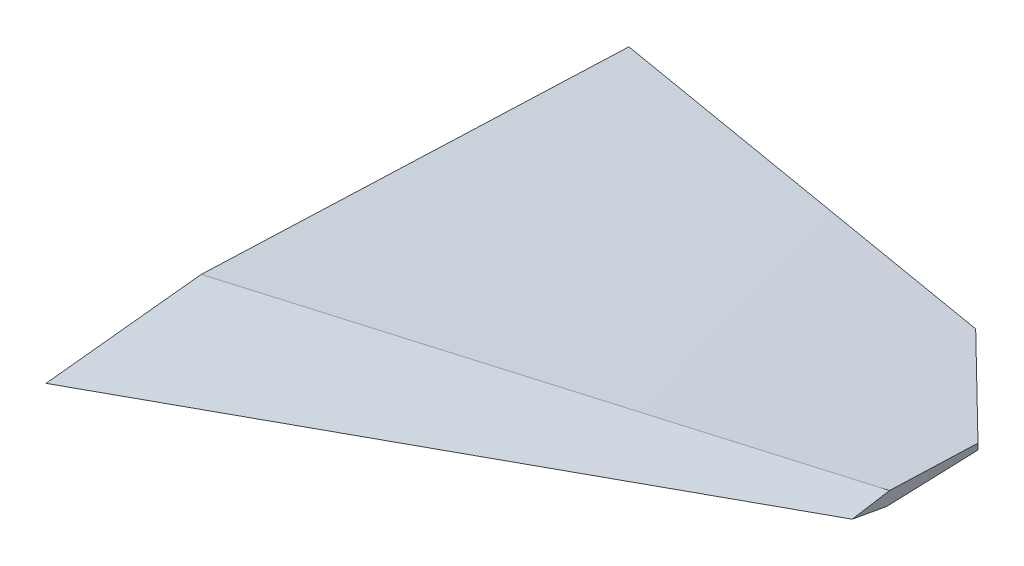
ISO-10303-21;
HEADER;
FILE_DESCRIPTION(('STEP AP214'),'2;1');
FILE_NAME('part.step','',(''),(''),'','','');
FILE_SCHEMA(('AUTOMOTIVE_DESIGN { 1 0 10303 214 1 1 1 1 }'));
ENDSEC;
DATA;
#1=APPLICATION_CONTEXT('core data for automotive mechanical design processes');
#2=APPLICATION_PROTOCOL_DEFINITION('international standard','automotive_design',2000,#1);
#3=PRODUCT_CONTEXT('',#1,'mechanical');
#4=PRODUCT('Part','Part','',(#3));
#5=PRODUCT_RELATED_PRODUCT_CATEGORY('part','',(#4));
#6=PRODUCT_DEFINITION_FORMATION('','',#4);
#7=PRODUCT_DEFINITION_CONTEXT('part definition',#1,'design');
#8=PRODUCT_DEFINITION('design','',#6,#7);
#9=PRODUCT_DEFINITION_SHAPE('','',#8);
#10=(LENGTH_UNIT() NAMED_UNIT(*) SI_UNIT(.MILLI.,.METRE.));
#11=(NAMED_UNIT(*) PLANE_ANGLE_UNIT() SI_UNIT($,.RADIAN.));
#12=(NAMED_UNIT(*) SI_UNIT($,.STERADIAN.) SOLID_ANGLE_UNIT());
#13=UNCERTAINTY_MEASURE_WITH_UNIT(LENGTH_MEASURE(1.E-05),#10,'distance_accuracy_value','');
#14=(GEOMETRIC_REPRESENTATION_CONTEXT(3) GLOBAL_UNCERTAINTY_ASSIGNED_CONTEXT((#13)) GLOBAL_UNIT_ASSIGNED_CONTEXT((#10,
#11,#12)) REPRESENTATION_CONTEXT('',''));
#15=CARTESIAN_POINT('',(0.,0.,0.));
#16=DIRECTION('',(0.,0.,1.));
#17=DIRECTION('',(1.,0.,0.));
#18=AXIS2_PLACEMENT_3D('',#15,#16,#17);
#19=CARTESIAN_POINT('',(2264.,0.,-7652.5));
#20=DIRECTION('',(-0.697531016860244,0.,0.716554590047342));
#21=DIRECTION('',(0.716554590047342,0.,0.697531016860244));
#22=AXIS2_PLACEMENT_3D('',#19,#20,#21);
#23=PLANE('',#22);
#24=DIRECTION('',(-0.181855240179557,-0.967259031099984,-0.177027224953551));
#25=VECTOR('',#24,1.);
#26=CARTESIAN_POINT('',(2777.18459449673,786.986197849038,-7152.93977526867));
#27=LINE('',#26,#25);
#28=CARTESIAN_POINT('',(2917.91105544952,1535.48780900373,-7015.94941504916));
#29=VERTEX_POINT('',#28);
#30=CARTESIAN_POINT('',(2912.13388329117,1504.75995129195,-7021.57321095549));
#31=VERTEX_POINT('',#30);
#32=EDGE_CURVE('E207',#29,#31,#27,.T.);
#33=ORIENTED_EDGE('',*,*,#32,.T.);
#34=CARTESIAN_POINT('',(2912.13388329117,1504.75995129195,-7021.5732109555));
#35=CARTESIAN_POINT('',(2902.12505219001,1507.11050301799,-7031.31632087699));
#36=CARTESIAN_POINT('',(2892.11583480539,1509.45785003662,-7041.05980682661));
#37=CARTESIAN_POINT('',(2872.09668602345,1514.14655406342,-7060.54747378248));
#38=CARTESIAN_POINT('',(2862.08675462657,1516.48791107528,-7070.29165478829));
#39=CARTESIAN_POINT('',(2842.0662283264,1521.16505638709,-7089.78066269111));
#40=CARTESIAN_POINT('',(2832.0556334234,1523.50084468943,-7099.52548958784));
#41=CARTESIAN_POINT('',(2812.03382465856,1528.16722504834,-7119.0157459076));
#42=CARTESIAN_POINT('',(2802.0226107969,1530.49781710633,-7128.76117533046));
#43=CARTESIAN_POINT('',(2781.99960507437,1535.15414719082,-7148.25259683026));
#44=CARTESIAN_POINT('',(2771.98781321359,1537.47988521806,-7157.99858890712));
#45=CARTESIAN_POINT('',(2751.96368880111,1542.12681900675,-7177.49109939715));
#46=CARTESIAN_POINT('',(2741.95135624944,1544.44801476844,-7187.23761781028));
#47=CARTESIAN_POINT('',(2721.92618674402,1549.08614906913,-7206.73114564742));
#48=CARTESIAN_POINT('',(2711.91334979036,1551.40308760891,-7216.47815507133));
#49=CARTESIAN_POINT('',(2691.8872002493,1556.03296983426,-7235.97263692547));
#50=CARTESIAN_POINT('',(2681.87388766183,1558.34591351929,-7245.72010935575));
#51=CARTESIAN_POINT('',(2661.84681532834,1562.96804671853,-7265.21548950339));
#52=CARTESIAN_POINT('',(2651.83305558223,1565.2772362319,-7274.96339722084));
#53=CARTESIAN_POINT('',(2631.80511511008,1569.89208237054,-7294.45962245921));
#54=CARTESIAN_POINT('',(2621.79093438393,1572.19773899477,-7304.20793998025));
#55=CARTESIAN_POINT('',(2601.76217621634,1576.80572440556,-7323.70496120533));
#56=CARTESIAN_POINT('',(2591.74759877477,1579.10805319095,-7333.45366490952));
#57=CARTESIAN_POINT('',(2571.71806912773,1583.70956861293,-7352.9514371323));
#58=CARTESIAN_POINT('',(2561.70311692212,1586.00875524826,-7362.70050565103));
#59=CARTESIAN_POINT('',(2551.68799055691,1588.30646313811,-7372.44974370566));
#60=B_SPLINE_CURVE_WITH_KNOTS('',3,(#34,#35,#36,#37,#38,#39,#40,#41,#42,#43,#44,#45,#46,#47,#48,
#49,#50,#51,#52,#53,#54,#55,#56,#57,#58,#59),.UNSPECIFIED.,.F.,.F.,(4,2,2,2,2,2,2,2,2,2,2,2,4),
(0.,42.4931735957222,84.9863210033463,127.4794502047,169.972567701935,212.465678779138,
254.958787715266,297.451888973896,339.944996179659,382.438112883539,424.931242053921,
467.424386167427,509.917547284836),.UNSPECIFIED.);
#61=CARTESIAN_POINT('',(2551.68799055691,1588.30646313811,-7372.44974370566));
#62=VERTEX_POINT('',#61);
#63=EDGE_CURVE('E12',#31,#62,#60,.T.);
#64=ORIENTED_EDGE('',*,*,#63,.T.);
#65=CARTESIAN_POINT('',(2551.68799055691,1588.30646313811,-7372.44974370566));
#66=CARTESIAN_POINT('',(2561.85908933415,1586.81545891525,-7362.5486740995));
#67=CARTESIAN_POINT('',(2572.03030381676,1585.32599148495,-7352.64749185979));
#68=CARTESIAN_POINT('',(2592.37297369507,1582.35032101549,-7332.8448928632));
#69=CARTESIAN_POINT('',(2602.54442909067,1580.86411797496,-7322.94347610643));
#70=CARTESIAN_POINT('',(2622.88759502421,1577.89516639539,-7303.14039422422));
#71=CARTESIAN_POINT('',(2633.05930556207,1576.41241785509,-7293.23872909888));
#72=CARTESIAN_POINT('',(2653.40299741478,1573.45058449897,-7273.43513525995));
#73=CARTESIAN_POINT('',(2663.57497872956,1571.97149968204,-7263.53320654645));
#74=CARTESIAN_POINT('',(2683.91922896556,1569.01721889018,-7243.72906914857));
#75=CARTESIAN_POINT('',(2694.09149788671,1567.54202291435,-7233.82686046426));
#76=CARTESIAN_POINT('',(2714.43634157628,1564.59576382112,-7214.02214536823));
#77=CARTESIAN_POINT('',(2724.60891634464,1563.12470070312,-7204.11963895654));
#78=CARTESIAN_POINT('',(2744.95439375768,1560.18697149333,-7184.31430696155));
#79=CARTESIAN_POINT('',(2755.1272964024,1558.72030540233,-7174.41148137819));
#80=CARTESIAN_POINT('',(2775.47344849196,1555.79165792881,-7154.60549261845));
#81=CARTESIAN_POINT('',(2785.64669793681,1554.32967654654,-7144.70232944205));
#82=CARTESIAN_POINT('',(2805.99356655332,1551.41071086214,-7124.89564317818));
#83=CARTESIAN_POINT('',(2816.16718572505,1549.9537265608,-7114.99212009066));
#84=CARTESIAN_POINT('',(2836.51481882396,1547.04509614959,-7095.18468964039));
#85=CARTESIAN_POINT('',(2846.68883275126,1545.59345004123,-7085.28078227754));
#86=CARTESIAN_POINT('',(2867.03728250197,1542.69586548015,-7065.47255685649));
#87=CARTESIAN_POINT('',(2877.21171832558,1541.24992702993,-7055.56823879811));
#88=CARTESIAN_POINT('',(2897.56104221048,1538.36417238011,-7035.75916244998));
#89=CARTESIAN_POINT('',(2907.73593027205,1536.92435618436,-7025.85440415995));
#90=CARTESIAN_POINT('',(2917.91105544952,1535.48780900373,-7015.94941504914));
#91=B_SPLINE_CURVE_WITH_KNOTS('',3,(#65,#66,#67,#68,#69,#70,#71,#72,#73,#74,#75,#76,#77,#78,#79,
#80,#81,#82,#83,#84,#85,#86,#87,#88,#89,#90),.UNSPECIFIED.,.F.,.F.,(4,2,2,2,2,2,2,2,2,2,2,2,4),
(0.,42.8176331472219,85.6352485668465,128.452848431335,171.270435344161,214.088012415988,
256.905583355069,299.723162072028,342.54074306137,385.358330773943,428.175930671245,
470.993549428293,513.81119517947),.UNSPECIFIED.);
#92=EDGE_CURVE('E57',#62,#29,#91,.T.);
#93=ORIENTED_EDGE('',*,*,#92,.T.);
#94=EDGE_LOOP('',(#33,#64,#93));
#95=FACE_BOUND('',#94,.T.);
#96=ADVANCED_FACE('F47',(#95),#23,.F.);
#97=CARTESIAN_POINT('',(2539.45761462919,-477.445709562425,7.03929742032787E-13));
#98=DIRECTION('',(0.982781120457582,-0.184773562156871,0.));
#99=DIRECTION('',(0.184773562156871,0.982781120457582,0.));
#100=AXIS2_PLACEMENT_3D('',#97,#98,#99);
#101=PLANE('',#100);
#102=ORIENTED_EDGE('',*,*,#32,.F.);
#103=DIRECTION('',(0.00827464295975354,0.044011506756951,0.998996755528701));
#104=VECTOR('',#103,1.);
#105=CARTESIAN_POINT('',(2921.00431932246,1551.94038641487,-6642.5));
#106=LINE('',#105,#104);
#107=CARTESIAN_POINT('',(2921.00431932246,1551.94038641487,-6642.5));
#108=VERTEX_POINT('',#107);
#109=EDGE_CURVE('E195',#29,#108,#106,.T.);
#110=ORIENTED_EDGE('',*,*,#109,.T.);
#111=DIRECTION('',(-0.0391264202249026,-0.208107191631007,0.977323140026798));
#112=VECTOR('',#111,1.);
#113=CARTESIAN_POINT('',(2914.99917855236,1520.,-6492.5));
#114=LINE('',#113,#112);
#115=CARTESIAN_POINT('',(2914.99917855236,1520.,-6492.5));
#116=VERTEX_POINT('',#115);
#117=EDGE_CURVE('E257',#108,#116,#114,.T.);
#118=ORIENTED_EDGE('',*,*,#117,.T.);
#119=DIRECTION('',(-0.0391264202249025,-0.208107191631009,-0.977323140026797));
#120=VECTOR('',#119,1.);
#121=CARTESIAN_POINT('',(2914.99917855236,1520.,-6492.5));
#122=LINE('',#121,#120);
#123=CARTESIAN_POINT('',(2908.99403778226,1488.05961358513,-6642.5));
#124=VERTEX_POINT('',#123);
#125=EDGE_CURVE('E104',#116,#124,#122,.T.);
#126=ORIENTED_EDGE('',*,*,#125,.T.);
#127=DIRECTION('',(0.00827464295975354,0.044011506756951,-0.998996755528701));
#128=VECTOR('',#127,1.);
#129=CARTESIAN_POINT('',(2908.99403778226,1488.05961358513,-6642.5));
#130=LINE('',#129,#128);
#131=EDGE_CURVE('E51',#124,#31,#130,.T.);
#132=ORIENTED_EDGE('',*,*,#131,.T.);
#133=EDGE_LOOP('',(#102,#110,#118,#126,#132));
#134=FACE_BOUND('',#133,.T.);
#135=ADVANCED_FACE('F149',(#134),#101,.T.);
#136=CARTESIAN_POINT('',(1079.99917855236,0.,0.));
#137=DIRECTION('',(1.,0.,0.));
#138=DIRECTION('',(0.,0.,-1.));
#139=AXIS2_PLACEMENT_3D('',#136,#137,#138);
#140=PLANE('',#139);
#141=DIRECTION('',(0.,-0.107073199719951,-0.994251140256692));
#142=VECTOR('',#141,1.);
#143=CARTESIAN_POINT('',(1079.99917855236,1865.,-4952.5));
#144=LINE('',#143,#142);
#145=CARTESIAN_POINT('',(1079.99917855236,1865.,-4952.5));
#146=VERTEX_POINT('',#145);
#147=CARTESIAN_POINT('',(1079.99917855236,1795.,-5602.5));
#148=VERTEX_POINT('',#147);
#149=EDGE_CURVE('E100',#146,#148,#144,.T.);
#150=ORIENTED_EDGE('',*,*,#149,.F.);
#151=DIRECTION('',(0.,-0.107073199719951,0.994251140256692));
#152=VECTOR('',#151,1.);
#153=CARTESIAN_POINT('',(1079.99917855236,1865.,-4952.5));
#154=LINE('',#153,#152);
#155=CARTESIAN_POINT('',(1079.99917855236,1935.,-5602.5));
#156=VERTEX_POINT('',#155);
#157=EDGE_CURVE('E112',#156,#146,#154,.T.);
#158=ORIENTED_EDGE('',*,*,#157,.F.);
#159=DIRECTION('',(0.,0.0390762771746633,0.999236230609243));
#160=VECTOR('',#159,1.);
#161=CARTESIAN_POINT('',(1079.99917855236,1935.,-5602.5));
#162=LINE('',#161,#160);
#163=CARTESIAN_POINT('',(1079.99917855236,1865.,-7392.5));
#164=VERTEX_POINT('',#163);
#165=EDGE_CURVE('E121',#164,#156,#162,.T.);
#166=ORIENTED_EDGE('',*,*,#165,.F.);
#167=DIRECTION('',(0.,0.0390762771746631,-0.999236230609243));
#168=VECTOR('',#167,1.);
#169=CARTESIAN_POINT('',(1079.99917855236,1795.,-5602.5));
#170=LINE('',#169,#168);
#171=EDGE_CURVE('E127',#148,#164,#170,.T.);
#172=ORIENTED_EDGE('',*,*,#171,.F.);
#173=EDGE_LOOP('',(#150,#158,#166,#172));
#174=FACE_BOUND('',#173,.T.);
#175=ADVANCED_FACE('F125',(#174),#140,.F.);
#176=CARTESIAN_POINT('',(1079.99917855236,1865.,-7392.5));
#177=CARTESIAN_POINT('',(2914.99917855236,1520.,-7367.5));
#178=CARTESIAN_POINT('',(1079.99917855236,1876.66666666667,-7094.16666666667));
#179=CARTESIAN_POINT('',(2916.00003534738,1525.32339773581,-7246.66666666669));
#180=CARTESIAN_POINT('',(1079.99917855236,1888.33333333333,-6795.83333333334));
#181=CARTESIAN_POINT('',(2917.00089214239,1530.64679547162,-7125.83333333337));
#182=CARTESIAN_POINT('',(1079.99917855236,1911.66666666667,-6199.16666666667));
#183=CARTESIAN_POINT('',(2919.00260573242,1541.29359094325,-6884.16666666671));
#184=CARTESIAN_POINT('',(1079.99917855236,1923.33333333333,-5900.83333333334));
#185=CARTESIAN_POINT('',(2920.00346252744,1546.61698867906,-6763.33333333336));
#186=CARTESIAN_POINT('',(1079.99917855236,1935.,-5602.5));
#187=CARTESIAN_POINT('',(2921.00431932246,1551.94038641487,-6642.5));
#188=B_SPLINE_SURFACE_WITH_KNOTS('',3,1,((#176,#177),(#178,#179),(#180,#181),(#182,#183),(#184,
#185),(#186,#187)),.UNSPECIFIED.,.F.,.F.,.F.,(4,2,4),(2,2),(0.,0.5,1.),(0.,1.),.UNSPECIFIED.);
#189=DIRECTION('',(-0.982693037901236,0.184757001676254,-0.0133881885272636));
#190=VECTOR('',#189,1.);
#191=CARTESIAN_POINT('',(1997.49917855236,1692.5,-7380.));
#192=LINE('',#191,#190);
#193=EDGE_CURVE('E120',#62,#164,#192,.T.);
#194=DIRECTION('',(0.856732455634059,-0.178261101032962,-0.483975701168718));
#195=VECTOR('',#194,1.);
#196=CARTESIAN_POINT('',(2000.50174893741,1743.47019320744,-6122.5));
#197=LINE('',#196,#195);
#198=EDGE_CURVE('E109',#156,#108,#197,.T.);
#199=ORIENTED_EDGE('',*,*,#92,.F.);
#200=ORIENTED_EDGE('',*,*,#193,.T.);
#201=ORIENTED_EDGE('',*,*,#165,.T.);
#202=ORIENTED_EDGE('',*,*,#198,.T.);
#203=ORIENTED_EDGE('',*,*,#109,.F.);
#204=EDGE_LOOP('',(#199,#200,#201,#202,#203));
#205=FACE_BOUND('',#204,.T.);
#206=ADVANCED_FACE('F148',(#205),#188,.T.);
#207=CARTESIAN_POINT('',(1079.99917855236,1935.,-5602.5));
#208=CARTESIAN_POINT('',(2921.00431932246,1551.94038641487,-6642.5));
#209=CARTESIAN_POINT('',(1079.99917855236,1923.33333333333,-5494.16666666666));
#210=CARTESIAN_POINT('',(2920.00346252744,1546.61698867906,-6617.49999999999));
#211=CARTESIAN_POINT('',(1079.99917855236,1911.66666666667,-5385.83333333333));
#212=CARTESIAN_POINT('',(2919.00260573242,1541.29359094325,-6592.49999999999));
#213=CARTESIAN_POINT('',(1079.99917855236,1888.33333333333,-5169.16666666666));
#214=CARTESIAN_POINT('',(2917.00089214239,1530.64679547162,-6542.49999999999));
#215=CARTESIAN_POINT('',(1079.99917855236,1876.66666666667,-5060.83333333333));
#216=CARTESIAN_POINT('',(2916.00003534738,1525.32339773581,-6517.49999999999));
#217=CARTESIAN_POINT('',(1079.99917855236,1865.,-4952.5));
#218=CARTESIAN_POINT('',(2914.99917855236,1520.,-6492.5));
#219=B_SPLINE_SURFACE_WITH_KNOTS('',3,1,((#207,#208),(#209,#210),(#211,#212),(#213,#214),(#215,
#216),(#217,#218)),.UNSPECIFIED.,.F.,.F.,.F.,(4,2,4),(2,2),(0.,0.5,1.),(0.,1.),.UNSPECIFIED.);
#220=DIRECTION('',(0.758170609986903,-0.142544338117429,-0.636284871596639));
#221=VECTOR('',#220,1.);
#222=CARTESIAN_POINT('',(1997.49917855236,1692.5,-5722.5));
#223=LINE('',#222,#221);
#224=EDGE_CURVE('E95',#146,#116,#223,.T.);
#225=ORIENTED_EDGE('',*,*,#157,.T.);
#226=ORIENTED_EDGE('',*,*,#224,.T.);
#227=ORIENTED_EDGE('',*,*,#117,.F.);
#228=ORIENTED_EDGE('',*,*,#198,.F.);
#229=EDGE_LOOP('',(#225,#226,#227,#228));
#230=FACE_BOUND('',#229,.T.);
#231=ADVANCED_FACE('F114',(#230),#219,.T.);
#232=CARTESIAN_POINT('',(1079.99917855236,1795.,-5602.5));
#233=CARTESIAN_POINT('',(2908.99403778226,1488.05961358513,-6642.5));
#234=CARTESIAN_POINT('',(1079.99917855236,1806.66666666667,-5900.83333333333));
#235=CARTESIAN_POINT('',(2909.99489457728,1493.38301132094,-6763.33333333332));
#236=CARTESIAN_POINT('',(1079.99917855236,1818.33333333333,-6199.16666666666));
#237=CARTESIAN_POINT('',(2910.99575137229,1498.70640905675,-6884.16666666665));
#238=CARTESIAN_POINT('',(1079.99917855236,1841.66666666667,-6795.83333333332));
#239=CARTESIAN_POINT('',(2912.99746496233,1509.35320452838,-7125.83333333332));
#240=CARTESIAN_POINT('',(1079.99917855236,1853.33333333333,-7094.16666666666));
#241=CARTESIAN_POINT('',(2913.99832175734,1514.67660226419,-7246.66666666666));
#242=CARTESIAN_POINT('',(1079.99917855236,1865.,-7392.5));
#243=CARTESIAN_POINT('',(2914.99917855236,1520.,-7367.5));
#244=B_SPLINE_SURFACE_WITH_KNOTS('',3,1,((#232,#233),(#234,#235),(#236,#237),(#238,#239),(#240,
#241),(#242,#243)),.UNSPECIFIED.,.F.,.F.,.F.,(4,2,4),(2,2),(0.,0.5,1.),(0.,1.),.UNSPECIFIED.);
#245=DIRECTION('',(0.860188376249254,-0.144356093328056,-0.489118876843588));
#246=VECTOR('',#245,1.);
#247=CARTESIAN_POINT('',(1994.49660816731,1641.52980679256,-6122.5));
#248=LINE('',#247,#246);
#249=EDGE_CURVE('E108',#148,#124,#248,.T.);
#250=ORIENTED_EDGE('',*,*,#63,.F.);
#251=ORIENTED_EDGE('',*,*,#131,.F.);
#252=ORIENTED_EDGE('',*,*,#249,.F.);
#253=ORIENTED_EDGE('',*,*,#171,.T.);
#254=ORIENTED_EDGE('',*,*,#193,.F.);
#255=EDGE_LOOP('',(#250,#251,#252,#253,#254));
#256=FACE_BOUND('',#255,.T.);
#257=ADVANCED_FACE('F216',(#256),#244,.T.);
#258=CARTESIAN_POINT('',(1079.99917855236,1865.,-4952.5));
#259=CARTESIAN_POINT('',(2914.99917855236,1520.,-6492.5));
#260=CARTESIAN_POINT('',(1079.99917855236,1853.33333333333,-5060.83333333332));
#261=CARTESIAN_POINT('',(2913.99832175734,1514.67660226419,-6517.5));
#262=CARTESIAN_POINT('',(1079.99917855236,1841.66666666667,-5169.16666666665));
#263=CARTESIAN_POINT('',(2912.99746496233,1509.35320452838,-6542.5));
#264=CARTESIAN_POINT('',(1079.99917855236,1818.33333333333,-5385.83333333332));
#265=CARTESIAN_POINT('',(2910.99575137229,1498.70640905675,-6592.5));
#266=CARTESIAN_POINT('',(1079.99917855236,1806.66666666667,-5494.16666666666));
#267=CARTESIAN_POINT('',(2909.99489457728,1493.38301132094,-6617.5));
#268=CARTESIAN_POINT('',(1079.99917855236,1795.,-5602.5));
#269=CARTESIAN_POINT('',(2908.99403778226,1488.05961358513,-6642.5));
#270=B_SPLINE_SURFACE_WITH_KNOTS('',3,1,((#258,#259),(#260,#261),(#262,#263),(#264,#265),(#266,
#267),(#268,#269)),.UNSPECIFIED.,.F.,.F.,.F.,(4,2,4),(2,2),(0.,0.5,1.),(0.,1.),.UNSPECIFIED.);
#271=ORIENTED_EDGE('',*,*,#149,.T.);
#272=ORIENTED_EDGE('',*,*,#249,.T.);
#273=ORIENTED_EDGE('',*,*,#125,.F.);
#274=ORIENTED_EDGE('',*,*,#224,.F.);
#275=EDGE_LOOP('',(#271,#272,#273,#274));
#276=FACE_BOUND('',#275,.T.);
#277=ADVANCED_FACE('F97',(#276),#270,.T.);
#278=CLOSED_SHELL('',(#96,#135,#175,#206,#231,#257,#277));
#279=MANIFOLD_SOLID_BREP('B2',#278);
#280=ADVANCED_BREP_SHAPE_REPRESENTATION('',(#18,#279),#14);
#281=SHAPE_DEFINITION_REPRESENTATION(#9,#280);
ENDSEC;
END-ISO-10303-21;
